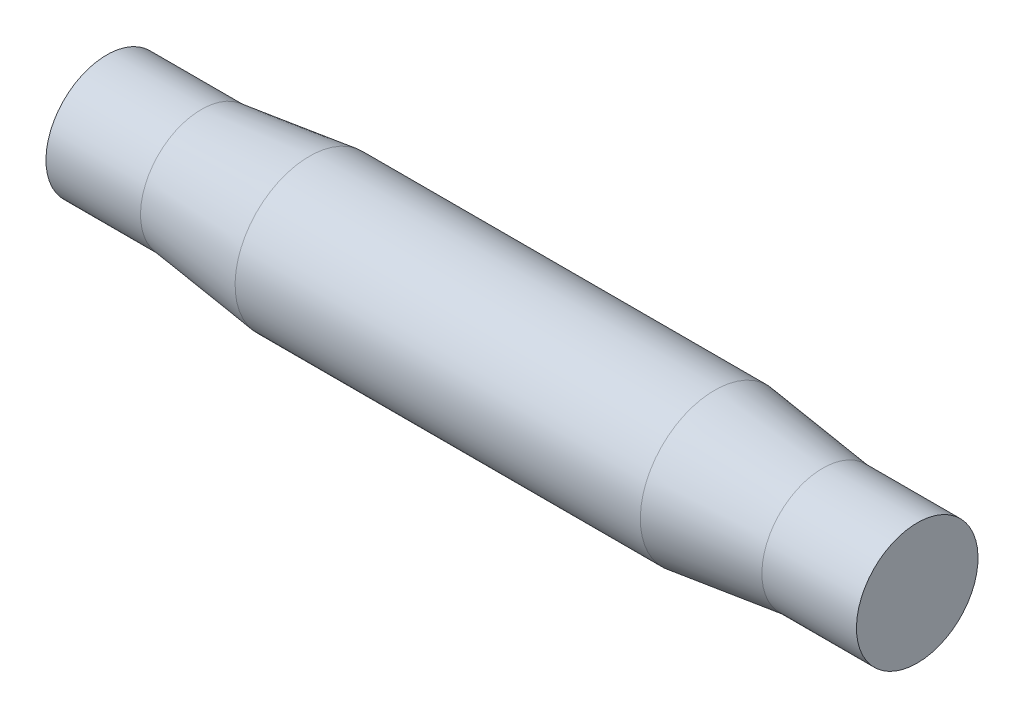
ISO-10303-21;
HEADER;
FILE_DESCRIPTION(('STEP AP214'),'2;1');
FILE_NAME('part.step','',(''),(''),'','','');
FILE_SCHEMA(('AUTOMOTIVE_DESIGN { 1 0 10303 214 1 1 1 1 }'));
ENDSEC;
DATA;
#1=APPLICATION_CONTEXT('core data for automotive mechanical design processes');
#2=APPLICATION_PROTOCOL_DEFINITION('international standard','automotive_design',2000,#1);
#3=PRODUCT_CONTEXT('',#1,'mechanical');
#4=PRODUCT('Part','Part','',(#3));
#5=PRODUCT_RELATED_PRODUCT_CATEGORY('part','',(#4));
#6=PRODUCT_DEFINITION_FORMATION('','',#4);
#7=PRODUCT_DEFINITION_CONTEXT('part definition',#1,'design');
#8=PRODUCT_DEFINITION('design','',#6,#7);
#9=PRODUCT_DEFINITION_SHAPE('','',#8);
#10=(LENGTH_UNIT() NAMED_UNIT(*) SI_UNIT(.MILLI.,.METRE.));
#11=(NAMED_UNIT(*) PLANE_ANGLE_UNIT() SI_UNIT($,.RADIAN.));
#12=(NAMED_UNIT(*) SI_UNIT($,.STERADIAN.) SOLID_ANGLE_UNIT());
#13=UNCERTAINTY_MEASURE_WITH_UNIT(LENGTH_MEASURE(1.E-05),#10,'distance_accuracy_value','');
#14=(GEOMETRIC_REPRESENTATION_CONTEXT(3) GLOBAL_UNCERTAINTY_ASSIGNED_CONTEXT((#13)) GLOBAL_UNIT_ASSIGNED_CONTEXT((#10,
#11,#12)) REPRESENTATION_CONTEXT('',''));
#15=CARTESIAN_POINT('',(0.,0.,0.));
#16=DIRECTION('',(0.,0.,1.));
#17=DIRECTION('',(1.,0.,0.));
#18=AXIS2_PLACEMENT_3D('',#15,#16,#17);
#19=CARTESIAN_POINT('',(30.,0.,0.));
#20=DIRECTION('',(-1.,0.,0.));
#21=DIRECTION('',(0.,-1.,0.));
#22=AXIS2_PLACEMENT_3D('',#19,#20,#21);
#23=PLANE('',#22);
#24=CARTESIAN_POINT('',(30.,0.,0.));
#25=DIRECTION('',(-1.,0.,0.));
#26=DIRECTION('',(0.,-1.,0.));
#27=AXIS2_PLACEMENT_3D('',#24,#25,#26);
#28=CIRCLE('',#27,4.5);
#29=CARTESIAN_POINT('',(30.,-4.5,0.));
#30=VERTEX_POINT('',#29);
#31=EDGE_CURVE('E10',#30,#30,#28,.T.);
#32=ORIENTED_EDGE('',*,*,#31,.F.);
#33=EDGE_LOOP('',(#32));
#34=FACE_BOUND('',#33,.T.);
#35=ADVANCED_FACE('F33',(#34),#23,.F.);
#36=CARTESIAN_POINT('',(-30.,0.,0.));
#37=DIRECTION('',(-1.,0.,0.));
#38=DIRECTION('',(0.,-1.,0.));
#39=AXIS2_PLACEMENT_3D('',#36,#37,#38);
#40=CYLINDRICAL_SURFACE('',#39,4.5);
#41=CARTESIAN_POINT('',(23.,0.,0.));
#42=DIRECTION('',(-1.,0.,0.));
#43=DIRECTION('',(0.,-1.,0.));
#44=AXIS2_PLACEMENT_3D('',#41,#42,#43);
#45=CIRCLE('',#44,4.5);
#46=CARTESIAN_POINT('',(23.,-4.5,0.));
#47=VERTEX_POINT('',#46);
#48=EDGE_CURVE('E39',#47,#47,#45,.T.);
#49=ORIENTED_EDGE('',*,*,#48,.F.);
#50=EDGE_LOOP('',(#49));
#51=FACE_BOUND('',#50,.T.);
#52=ORIENTED_EDGE('',*,*,#31,.T.);
#53=EDGE_LOOP('',(#52));
#54=FACE_BOUND('',#53,.T.);
#55=ADVANCED_FACE('F81',(#51,#54),#40,.T.);
#56=CARTESIAN_POINT('',(23.,0.,0.));
#57=DIRECTION('',(-1.,0.,0.));
#58=DIRECTION('',(0.,-1.,0.));
#59=AXIS2_PLACEMENT_3D('',#56,#57,#58);
#60=CONICAL_SURFACE('',#59,4.5,0.124354994546762);
#61=CARTESIAN_POINT('',(15.,0.,0.));
#62=DIRECTION('',(-1.,0.,0.));
#63=DIRECTION('',(0.,-1.,0.));
#64=AXIS2_PLACEMENT_3D('',#61,#62,#63);
#65=CIRCLE('',#64,5.5);
#66=CARTESIAN_POINT('',(15.,-5.5,0.));
#67=VERTEX_POINT('',#66);
#68=EDGE_CURVE('E43',#67,#67,#65,.T.);
#69=ORIENTED_EDGE('',*,*,#68,.F.);
#70=EDGE_LOOP('',(#69));
#71=FACE_BOUND('',#70,.T.);
#72=ORIENTED_EDGE('',*,*,#48,.T.);
#73=EDGE_LOOP('',(#72));
#74=FACE_BOUND('',#73,.T.);
#75=ADVANCED_FACE('F76',(#71,#74),#60,.T.);
#76=CARTESIAN_POINT('',(-30.,0.,0.));
#77=DIRECTION('',(-1.,0.,0.));
#78=DIRECTION('',(0.,-1.,0.));
#79=AXIS2_PLACEMENT_3D('',#76,#77,#78);
#80=CYLINDRICAL_SURFACE('',#79,5.5);
#81=CARTESIAN_POINT('',(-15.,0.,0.));
#82=DIRECTION('',(-1.,0.,0.));
#83=DIRECTION('',(0.,-1.,0.));
#84=AXIS2_PLACEMENT_3D('',#81,#82,#83);
#85=CIRCLE('',#84,5.5);
#86=CARTESIAN_POINT('',(-15.,-5.5,0.));
#87=VERTEX_POINT('',#86);
#88=EDGE_CURVE('E47',#87,#87,#85,.T.);
#89=ORIENTED_EDGE('',*,*,#88,.F.);
#90=EDGE_LOOP('',(#89));
#91=FACE_BOUND('',#90,.T.);
#92=ORIENTED_EDGE('',*,*,#68,.T.);
#93=EDGE_LOOP('',(#92));
#94=FACE_BOUND('',#93,.T.);
#95=ADVANCED_FACE('F70',(#91,#94),#80,.T.);
#96=CARTESIAN_POINT('',(-15.,0.,0.));
#97=DIRECTION('',(1.,0.,0.));
#98=DIRECTION('',(0.,1.,0.));
#99=AXIS2_PLACEMENT_3D('',#96,#97,#98);
#100=CONICAL_SURFACE('',#99,5.5,0.124354994546762);
#101=CARTESIAN_POINT('',(-23.,0.,0.));
#102=DIRECTION('',(-1.,0.,0.));
#103=DIRECTION('',(0.,-1.,0.));
#104=AXIS2_PLACEMENT_3D('',#101,#102,#103);
#105=CIRCLE('',#104,4.5);
#106=CARTESIAN_POINT('',(-23.,-4.49999999999999,0.));
#107=VERTEX_POINT('',#106);
#108=EDGE_CURVE('E52',#107,#107,#105,.T.);
#109=ORIENTED_EDGE('',*,*,#108,.F.);
#110=EDGE_LOOP('',(#109));
#111=FACE_BOUND('',#110,.T.);
#112=ORIENTED_EDGE('',*,*,#88,.T.);
#113=EDGE_LOOP('',(#112));
#114=FACE_BOUND('',#113,.T.);
#115=ADVANCED_FACE('F64',(#111,#114),#100,.T.);
#116=CARTESIAN_POINT('',(-30.,0.,0.));
#117=DIRECTION('',(-1.,0.,0.));
#118=DIRECTION('',(0.,-1.,0.));
#119=AXIS2_PLACEMENT_3D('',#116,#117,#118);
#120=CYLINDRICAL_SURFACE('',#119,4.5);
#121=CARTESIAN_POINT('',(-30.,0.,0.));
#122=DIRECTION('',(-1.,0.,0.));
#123=DIRECTION('',(0.,-1.,0.));
#124=AXIS2_PLACEMENT_3D('',#121,#122,#123);
#125=CIRCLE('',#124,4.5);
#126=CARTESIAN_POINT('',(-30.,-4.49999999999999,0.));
#127=VERTEX_POINT('',#126);
#128=EDGE_CURVE('E55',#127,#127,#125,.T.);
#129=ORIENTED_EDGE('',*,*,#128,.F.);
#130=EDGE_LOOP('',(#129));
#131=FACE_BOUND('',#130,.T.);
#132=ORIENTED_EDGE('',*,*,#108,.T.);
#133=EDGE_LOOP('',(#132));
#134=FACE_BOUND('',#133,.T.);
#135=ADVANCED_FACE('F61',(#131,#134),#120,.T.);
#136=CARTESIAN_POINT('',(-30.,0.,0.));
#137=DIRECTION('',(1.,0.,0.));
#138=DIRECTION('',(0.,1.,0.));
#139=AXIS2_PLACEMENT_3D('',#136,#137,#138);
#140=PLANE('',#139);
#141=ORIENTED_EDGE('',*,*,#128,.T.);
#142=EDGE_LOOP('',(#141));
#143=FACE_BOUND('',#142,.T.);
#144=ADVANCED_FACE('F59',(#143),#140,.F.);
#145=CLOSED_SHELL('',(#35,#55,#75,#95,#115,#135,#144));
#146=MANIFOLD_SOLID_BREP('B2',#145);
#147=ADVANCED_BREP_SHAPE_REPRESENTATION('',(#18,#146),#14);
#148=SHAPE_DEFINITION_REPRESENTATION(#9,#147);
ENDSEC;
END-ISO-10303-21;
